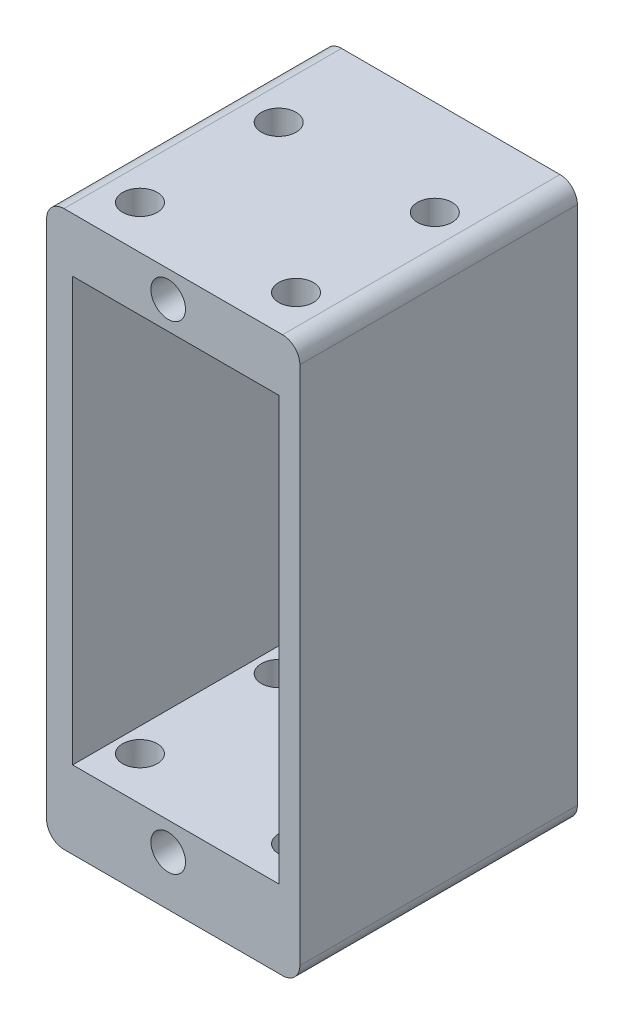
ISO-10303-21;
HEADER;
FILE_DESCRIPTION(('STEP AP214'),'2;1');
FILE_NAME('part.step','',(''),(''),'','','');
FILE_SCHEMA(('AUTOMOTIVE_DESIGN { 1 0 10303 214 1 1 1 1 }'));
ENDSEC;
DATA;
#1=APPLICATION_CONTEXT('core data for automotive mechanical design processes');
#2=APPLICATION_PROTOCOL_DEFINITION('international standard','automotive_design',2000,#1);
#3=PRODUCT_CONTEXT('',#1,'mechanical');
#4=PRODUCT('Part','Part','',(#3));
#5=PRODUCT_RELATED_PRODUCT_CATEGORY('part','',(#4));
#6=PRODUCT_DEFINITION_FORMATION('','',#4);
#7=PRODUCT_DEFINITION_CONTEXT('part definition',#1,'design');
#8=PRODUCT_DEFINITION('design','',#6,#7);
#9=PRODUCT_DEFINITION_SHAPE('','',#8);
#10=(LENGTH_UNIT() NAMED_UNIT(*) SI_UNIT(.MILLI.,.METRE.));
#11=(NAMED_UNIT(*) PLANE_ANGLE_UNIT() SI_UNIT($,.RADIAN.));
#12=(NAMED_UNIT(*) SI_UNIT($,.STERADIAN.) SOLID_ANGLE_UNIT());
#13=UNCERTAINTY_MEASURE_WITH_UNIT(LENGTH_MEASURE(1.E-05),#10,'distance_accuracy_value','');
#14=(GEOMETRIC_REPRESENTATION_CONTEXT(3) GLOBAL_UNCERTAINTY_ASSIGNED_CONTEXT((#13)) GLOBAL_UNIT_ASSIGNED_CONTEXT((#10,
#11,#12)) REPRESENTATION_CONTEXT('',''));
#15=CARTESIAN_POINT('',(0.,0.,0.));
#16=DIRECTION('',(0.,0.,1.));
#17=DIRECTION('',(1.,0.,0.));
#18=AXIS2_PLACEMENT_3D('',#15,#16,#17);
#19=CARTESIAN_POINT('',(-106.71772522006,235.327818509475,16.));
#20=DIRECTION('',(1.,0.,0.));
#21=DIRECTION('',(0.,0.,-1.));
#22=AXIS2_PLACEMENT_3D('',#19,#20,#21);
#23=PLANE('',#22);
#24=DIRECTION('',(0.,-1.,0.));
#25=VECTOR('',#24,1.);
#26=CARTESIAN_POINT('',(-106.71772522006,235.327818509475,0.));
#27=LINE('',#26,#25);
#28=CARTESIAN_POINT('',(-106.71772522006,234.327818509475,0.));
#29=VERTEX_POINT('',#28);
#30=CARTESIAN_POINT('',(-106.71772522006,204.327818509475,0.));
#31=VERTEX_POINT('',#30);
#32=EDGE_CURVE('E165',#29,#31,#27,.T.);
#33=ORIENTED_EDGE('',*,*,#32,.T.);
#34=DIRECTION('',(0.,0.,-1.));
#35=VECTOR('',#34,1.);
#36=CARTESIAN_POINT('',(-106.71772522006,204.327818509475,16.));
#37=LINE('',#36,#35);
#38=CARTESIAN_POINT('',(-106.71772522006,204.327818509475,16.));
#39=VERTEX_POINT('',#38);
#40=EDGE_CURVE('E221',#31,#39,#37,.F.);
#41=ORIENTED_EDGE('',*,*,#40,.T.);
#42=DIRECTION('',(0.,-1.,0.));
#43=VECTOR('',#42,1.);
#44=CARTESIAN_POINT('',(-106.71772522006,235.327818509475,16.));
#45=LINE('',#44,#43);
#46=CARTESIAN_POINT('',(-106.71772522006,234.327818509475,16.));
#47=VERTEX_POINT('',#46);
#48=EDGE_CURVE('E169',#47,#39,#45,.T.);
#49=ORIENTED_EDGE('',*,*,#48,.F.);
#50=DIRECTION('',(0.,0.,-1.));
#51=VECTOR('',#50,1.);
#52=CARTESIAN_POINT('',(-106.71772522006,234.327818509475,16.));
#53=LINE('',#52,#51);
#54=EDGE_CURVE('E218',#47,#29,#53,.T.);
#55=ORIENTED_EDGE('',*,*,#54,.T.);
#56=EDGE_LOOP('',(#33,#41,#49,#55));
#57=FACE_BOUND('',#56,.T.);
#58=ADVANCED_FACE('F37',(#57),#23,.F.);
#59=CARTESIAN_POINT('',(-106.71772522006,203.327818509475,16.));
#60=DIRECTION('',(0.,1.,0.));
#61=DIRECTION('',(0.,0.,1.));
#62=AXIS2_PLACEMENT_3D('',#59,#60,#61);
#63=PLANE('',#62);
#64=CARTESIAN_POINT('',(-103.837557168766,203.327818509475,13.5));
#65=DIRECTION('',(0.,1.,0.));
#66=DIRECTION('',(0.,0.,1.));
#67=AXIS2_PLACEMENT_3D('',#64,#65,#66);
#68=CIRCLE('',#67,0.999999999999998);
#69=CARTESIAN_POINT('',(-103.837557168766,203.327818509475,14.5));
#70=VERTEX_POINT('',#69);
#71=EDGE_CURVE('E366',#70,#70,#68,.T.);
#72=ORIENTED_EDGE('',*,*,#71,.T.);
#73=EDGE_LOOP('',(#72));
#74=FACE_BOUND('',#73,.T.);
#75=CARTESIAN_POINT('',(-94.8375571687659,203.327818509475,13.5));
#76=DIRECTION('',(0.,1.,0.));
#77=DIRECTION('',(0.,0.,1.));
#78=AXIS2_PLACEMENT_3D('',#75,#76,#77);
#79=CIRCLE('',#78,0.999999999999998);
#80=CARTESIAN_POINT('',(-94.8375571687659,203.327818509475,14.5));
#81=VERTEX_POINT('',#80);
#82=EDGE_CURVE('E369',#81,#81,#79,.T.);
#83=ORIENTED_EDGE('',*,*,#82,.T.);
#84=EDGE_LOOP('',(#83));
#85=FACE_BOUND('',#84,.T.);
#86=CARTESIAN_POINT('',(-94.837557168766,203.327818509475,5.5));
#87=DIRECTION('',(0.,1.,0.));
#88=DIRECTION('',(0.,0.,1.));
#89=AXIS2_PLACEMENT_3D('',#86,#87,#88);
#90=CIRCLE('',#89,0.999999999999998);
#91=CARTESIAN_POINT('',(-94.837557168766,203.327818509475,6.5));
#92=VERTEX_POINT('',#91);
#93=EDGE_CURVE('E359',#92,#92,#90,.T.);
#94=ORIENTED_EDGE('',*,*,#93,.T.);
#95=EDGE_LOOP('',(#94));
#96=FACE_BOUND('',#95,.T.);
#97=CARTESIAN_POINT('',(-103.837557168766,203.327818509475,5.5));
#98=DIRECTION('',(0.,1.,0.));
#99=DIRECTION('',(0.,0.,1.));
#100=AXIS2_PLACEMENT_3D('',#97,#98,#99);
#101=CIRCLE('',#100,0.999999999999998);
#102=CARTESIAN_POINT('',(-103.837557168766,203.327818509475,6.5));
#103=VERTEX_POINT('',#102);
#104=EDGE_CURVE('E228',#103,#103,#101,.T.);
#105=ORIENTED_EDGE('',*,*,#104,.T.);
#106=EDGE_LOOP('',(#105));
#107=FACE_BOUND('',#106,.T.);
#108=DIRECTION('',(1.,0.,0.));
#109=VECTOR('',#108,1.);
#110=CARTESIAN_POINT('',(-106.71772522006,203.327818509475,0.));
#111=LINE('',#110,#109);
#112=CARTESIAN_POINT('',(-105.71772522006,203.327818509475,0.));
#113=VERTEX_POINT('',#112);
#114=CARTESIAN_POINT('',(-93.1177252200604,203.327818509475,0.));
#115=VERTEX_POINT('',#114);
#116=EDGE_CURVE('E185',#113,#115,#111,.T.);
#117=ORIENTED_EDGE('',*,*,#116,.T.);
#118=DIRECTION('',(0.,0.,-1.));
#119=VECTOR('',#118,1.);
#120=CARTESIAN_POINT('',(-93.1177252200604,203.327818509475,16.));
#121=LINE('',#120,#119);
#122=CARTESIAN_POINT('',(-93.1177252200604,203.327818509475,16.));
#123=VERTEX_POINT('',#122);
#124=EDGE_CURVE('E208',#115,#123,#121,.F.);
#125=ORIENTED_EDGE('',*,*,#124,.T.);
#126=DIRECTION('',(1.,0.,0.));
#127=VECTOR('',#126,1.);
#128=CARTESIAN_POINT('',(-106.71772522006,203.327818509475,16.));
#129=LINE('',#128,#127);
#130=CARTESIAN_POINT('',(-105.71772522006,203.327818509475,16.));
#131=VERTEX_POINT('',#130);
#132=EDGE_CURVE('E172',#131,#123,#129,.T.);
#133=ORIENTED_EDGE('',*,*,#132,.F.);
#134=DIRECTION('',(0.,0.,-1.));
#135=VECTOR('',#134,1.);
#136=CARTESIAN_POINT('',(-105.71772522006,203.327818509475,16.));
#137=LINE('',#136,#135);
#138=EDGE_CURVE('E205',#131,#113,#137,.T.);
#139=ORIENTED_EDGE('',*,*,#138,.T.);
#140=EDGE_LOOP('',(#117,#125,#133,#139));
#141=FACE_BOUND('',#140,.T.);
#142=ADVANCED_FACE('F302',(#74,#85,#96,#107,#141),#63,.F.);
#143=CARTESIAN_POINT('',(-92.1177252200604,235.327818509475,16.));
#144=DIRECTION('',(-1.,0.,0.));
#145=DIRECTION('',(0.,0.,1.));
#146=AXIS2_PLACEMENT_3D('',#143,#144,#145);
#147=PLANE('',#146);
#148=DIRECTION('',(0.,1.,0.));
#149=VECTOR('',#148,1.);
#150=CARTESIAN_POINT('',(-92.1177252200604,235.327818509475,16.));
#151=LINE('',#150,#149);
#152=CARTESIAN_POINT('',(-92.1177252200604,204.327818509475,16.));
#153=VERTEX_POINT('',#152);
#154=CARTESIAN_POINT('',(-92.1177252200604,234.327818509475,16.));
#155=VERTEX_POINT('',#154);
#156=EDGE_CURVE('E176',#153,#155,#151,.T.);
#157=ORIENTED_EDGE('',*,*,#156,.F.);
#158=DIRECTION('',(0.,0.,-1.));
#159=VECTOR('',#158,1.);
#160=CARTESIAN_POINT('',(-92.1177252200604,204.327818509475,16.));
#161=LINE('',#160,#159);
#162=CARTESIAN_POINT('',(-92.1177252200604,204.327818509475,0.));
#163=VERTEX_POINT('',#162);
#164=EDGE_CURVE('E194',#153,#163,#161,.T.);
#165=ORIENTED_EDGE('',*,*,#164,.T.);
#166=DIRECTION('',(0.,1.,0.));
#167=VECTOR('',#166,1.);
#168=CARTESIAN_POINT('',(-92.1177252200604,235.327818509475,0.));
#169=LINE('',#168,#167);
#170=CARTESIAN_POINT('',(-92.1177252200604,234.327818509475,0.));
#171=VERTEX_POINT('',#170);
#172=EDGE_CURVE('E188',#163,#171,#169,.T.);
#173=ORIENTED_EDGE('',*,*,#172,.T.);
#174=DIRECTION('',(0.,0.,-1.));
#175=VECTOR('',#174,1.);
#176=CARTESIAN_POINT('',(-92.1177252200604,234.327818509475,16.));
#177=LINE('',#176,#175);
#178=EDGE_CURVE('E182',#171,#155,#177,.F.);
#179=ORIENTED_EDGE('',*,*,#178,.T.);
#180=EDGE_LOOP('',(#157,#165,#173,#179));
#181=FACE_BOUND('',#180,.T.);
#182=ADVANCED_FACE('F282',(#181),#147,.F.);
#183=CARTESIAN_POINT('',(-106.71772522006,235.327818509475,16.));
#184=DIRECTION('',(0.,-1.,0.));
#185=DIRECTION('',(0.,0.,-1.));
#186=AXIS2_PLACEMENT_3D('',#183,#184,#185);
#187=PLANE('',#186);
#188=CARTESIAN_POINT('',(-103.837557168766,235.327818509475,13.5));
#189=DIRECTION('',(0.,1.,0.));
#190=DIRECTION('',(0.,0.,1.));
#191=AXIS2_PLACEMENT_3D('',#188,#189,#190);
#192=CIRCLE('',#191,0.999999999999998);
#193=CARTESIAN_POINT('',(-103.837557168766,235.327818509475,14.5));
#194=VERTEX_POINT('',#193);
#195=EDGE_CURVE('E346',#194,#194,#192,.T.);
#196=ORIENTED_EDGE('',*,*,#195,.F.);
#197=EDGE_LOOP('',(#196));
#198=FACE_BOUND('',#197,.T.);
#199=CARTESIAN_POINT('',(-94.8375571687659,235.327818509475,13.5));
#200=DIRECTION('',(0.,1.,0.));
#201=DIRECTION('',(0.,0.,1.));
#202=AXIS2_PLACEMENT_3D('',#199,#200,#201);
#203=CIRCLE('',#202,0.999999999999998);
#204=CARTESIAN_POINT('',(-94.8375571687659,235.327818509475,14.5));
#205=VERTEX_POINT('',#204);
#206=EDGE_CURVE('E350',#205,#205,#203,.T.);
#207=ORIENTED_EDGE('',*,*,#206,.F.);
#208=EDGE_LOOP('',(#207));
#209=FACE_BOUND('',#208,.T.);
#210=CARTESIAN_POINT('',(-94.837557168766,235.327818509475,5.5));
#211=DIRECTION('',(0.,1.,0.));
#212=DIRECTION('',(0.,0.,1.));
#213=AXIS2_PLACEMENT_3D('',#210,#211,#212);
#214=CIRCLE('',#213,0.999999999999998);
#215=CARTESIAN_POINT('',(-94.837557168766,235.327818509475,6.5));
#216=VERTEX_POINT('',#215);
#217=EDGE_CURVE('E354',#216,#216,#214,.T.);
#218=ORIENTED_EDGE('',*,*,#217,.F.);
#219=EDGE_LOOP('',(#218));
#220=FACE_BOUND('',#219,.T.);
#221=CARTESIAN_POINT('',(-103.837557168766,235.327818509475,5.5));
#222=DIRECTION('',(0.,1.,0.));
#223=DIRECTION('',(0.,0.,1.));
#224=AXIS2_PLACEMENT_3D('',#221,#222,#223);
#225=CIRCLE('',#224,0.999999999999998);
#226=CARTESIAN_POINT('',(-103.837557168766,235.327818509475,6.5));
#227=VERTEX_POINT('',#226);
#228=EDGE_CURVE('E357',#227,#227,#225,.T.);
#229=ORIENTED_EDGE('',*,*,#228,.F.);
#230=EDGE_LOOP('',(#229));
#231=FACE_BOUND('',#230,.T.);
#232=DIRECTION('',(-1.,0.,0.));
#233=VECTOR('',#232,1.);
#234=CARTESIAN_POINT('',(-106.71772522006,235.327818509475,16.));
#235=LINE('',#234,#233);
#236=CARTESIAN_POINT('',(-93.1177252200604,235.327818509475,16.));
#237=VERTEX_POINT('',#236);
#238=CARTESIAN_POINT('',(-105.71772522006,235.327818509475,16.));
#239=VERTEX_POINT('',#238);
#240=EDGE_CURVE('E179',#237,#239,#235,.T.);
#241=ORIENTED_EDGE('',*,*,#240,.F.);
#242=DIRECTION('',(0.,0.,-1.));
#243=VECTOR('',#242,1.);
#244=CARTESIAN_POINT('',(-93.1177252200604,235.327818509475,16.));
#245=LINE('',#244,#243);
#246=CARTESIAN_POINT('',(-93.1177252200604,235.327818509475,0.));
#247=VERTEX_POINT('',#246);
#248=EDGE_CURVE('E11',#237,#247,#245,.T.);
#249=ORIENTED_EDGE('',*,*,#248,.T.);
#250=DIRECTION('',(-1.,0.,0.));
#251=VECTOR('',#250,1.);
#252=CARTESIAN_POINT('',(-106.71772522006,235.327818509475,0.));
#253=LINE('',#252,#251);
#254=CARTESIAN_POINT('',(-105.71772522006,235.327818509475,0.));
#255=VERTEX_POINT('',#254);
#256=EDGE_CURVE('E173',#247,#255,#253,.T.);
#257=ORIENTED_EDGE('',*,*,#256,.T.);
#258=DIRECTION('',(0.,0.,-1.));
#259=VECTOR('',#258,1.);
#260=CARTESIAN_POINT('',(-105.71772522006,235.327818509475,16.));
#261=LINE('',#260,#259);
#262=EDGE_CURVE('E46',#255,#239,#261,.F.);
#263=ORIENTED_EDGE('',*,*,#262,.T.);
#264=EDGE_LOOP('',(#241,#249,#257,#263));
#265=FACE_BOUND('',#264,.T.);
#266=ADVANCED_FACE('F265',(#198,#209,#220,#231,#265),#187,.F.);
#267=CARTESIAN_POINT('',(0.,0.,16.));
#268=DIRECTION('',(0.,0.,1.));
#269=DIRECTION('',(1.,0.,0.));
#270=AXIS2_PLACEMENT_3D('',#267,#268,#269);
#271=PLANE('',#270);
#272=CARTESIAN_POINT('',(-99.7091223045707,233.799996948242,16.));
#273=DIRECTION('',(0.,0.,1.));
#274=DIRECTION('',(1.,0.,0.));
#275=AXIS2_PLACEMENT_3D('',#272,#273,#274);
#276=CIRCLE('',#275,0.999999999999998);
#277=CARTESIAN_POINT('',(-98.7091223045707,233.799996948242,16.));
#278=VERTEX_POINT('',#277);
#279=EDGE_CURVE('E251',#278,#278,#276,.T.);
#280=ORIENTED_EDGE('',*,*,#279,.F.);
#281=EDGE_LOOP('',(#280));
#282=FACE_BOUND('',#281,.T.);
#283=CARTESIAN_POINT('',(-99.7091223045707,206.199996948242,16.));
#284=DIRECTION('',(0.,0.,1.));
#285=DIRECTION('',(1.,0.,0.));
#286=AXIS2_PLACEMENT_3D('',#283,#284,#285);
#287=CIRCLE('',#286,0.999999999999998);
#288=CARTESIAN_POINT('',(-98.7091223045707,206.199996948242,16.));
#289=VERTEX_POINT('',#288);
#290=EDGE_CURVE('E152',#289,#289,#287,.T.);
#291=ORIENTED_EDGE('',*,*,#290,.F.);
#292=EDGE_LOOP('',(#291));
#293=FACE_BOUND('',#292,.T.);
#294=DIRECTION('',(0.,-1.,0.));
#295=VECTOR('',#294,1.);
#296=CARTESIAN_POINT('',(-105.21772522006,232.199996948242,16.));
#297=LINE('',#296,#295);
#298=CARTESIAN_POINT('',(-105.21772522006,232.199996948242,16.));
#299=VERTEX_POINT('',#298);
#300=CARTESIAN_POINT('',(-105.21772522006,207.799996948242,16.));
#301=VERTEX_POINT('',#300);
#302=EDGE_CURVE('E54',#299,#301,#297,.T.);
#303=ORIENTED_EDGE('',*,*,#302,.F.);
#304=DIRECTION('',(-1.,0.,0.));
#305=VECTOR('',#304,1.);
#306=CARTESIAN_POINT('',(-105.21772522006,232.199996948242,16.));
#307=LINE('',#306,#305);
#308=CARTESIAN_POINT('',(-93.3177252200605,232.199996948242,16.));
#309=VERTEX_POINT('',#308);
#310=EDGE_CURVE('E146',#309,#299,#307,.T.);
#311=ORIENTED_EDGE('',*,*,#310,.F.);
#312=DIRECTION('',(0.,1.,0.));
#313=VECTOR('',#312,1.);
#314=CARTESIAN_POINT('',(-93.3177252200605,232.199996948242,16.));
#315=LINE('',#314,#313);
#316=CARTESIAN_POINT('',(-93.3177252200605,207.799996948242,16.));
#317=VERTEX_POINT('',#316);
#318=EDGE_CURVE('E149',#317,#309,#315,.T.);
#319=ORIENTED_EDGE('',*,*,#318,.F.);
#320=DIRECTION('',(1.,0.,0.));
#321=VECTOR('',#320,1.);
#322=CARTESIAN_POINT('',(-105.21772522006,207.799996948242,16.));
#323=LINE('',#322,#321);
#324=EDGE_CURVE('E158',#301,#317,#323,.T.);
#325=ORIENTED_EDGE('',*,*,#324,.F.);
#326=EDGE_LOOP('',(#303,#311,#319,#325));
#327=FACE_BOUND('',#326,.T.);
#328=ORIENTED_EDGE('',*,*,#132,.T.);
#329=CARTESIAN_POINT('',(-93.1177252200604,204.327818509475,16.));
#330=DIRECTION('',(0.,0.,1.));
#331=DIRECTION('',(1.,0.,0.));
#332=AXIS2_PLACEMENT_3D('',#329,#330,#331);
#333=CIRCLE('',#332,1.);
#334=EDGE_CURVE('E216',#123,#153,#333,.T.);
#335=ORIENTED_EDGE('',*,*,#334,.T.);
#336=ORIENTED_EDGE('',*,*,#156,.T.);
#337=CARTESIAN_POINT('',(-93.1177252200604,234.327818509475,16.));
#338=DIRECTION('',(0.,0.,1.));
#339=DIRECTION('',(1.,0.,0.));
#340=AXIS2_PLACEMENT_3D('',#337,#338,#339);
#341=CIRCLE('',#340,1.);
#342=EDGE_CURVE('E212',#155,#237,#341,.T.);
#343=ORIENTED_EDGE('',*,*,#342,.T.);
#344=ORIENTED_EDGE('',*,*,#240,.T.);
#345=CARTESIAN_POINT('',(-105.71772522006,234.327818509475,16.));
#346=DIRECTION('',(0.,0.,1.));
#347=DIRECTION('',(1.,0.,0.));
#348=AXIS2_PLACEMENT_3D('',#345,#346,#347);
#349=CIRCLE('',#348,1.);
#350=EDGE_CURVE('E210',#239,#47,#349,.T.);
#351=ORIENTED_EDGE('',*,*,#350,.T.);
#352=ORIENTED_EDGE('',*,*,#48,.T.);
#353=CARTESIAN_POINT('',(-105.71772522006,204.327818509475,16.));
#354=DIRECTION('',(0.,0.,1.));
#355=DIRECTION('',(1.,0.,0.));
#356=AXIS2_PLACEMENT_3D('',#353,#354,#355);
#357=CIRCLE('',#356,1.);
#358=EDGE_CURVE('E214',#39,#131,#357,.T.);
#359=ORIENTED_EDGE('',*,*,#358,.T.);
#360=EDGE_LOOP('',(#328,#335,#336,#343,#344,#351,#352,#359));
#361=FACE_BOUND('',#360,.T.);
#362=ADVANCED_FACE('F262',(#282,#293,#327,#361),#271,.T.);
#363=CARTESIAN_POINT('',(0.,0.,0.));
#364=DIRECTION('',(0.,0.,1.));
#365=DIRECTION('',(1.,0.,0.));
#366=AXIS2_PLACEMENT_3D('',#363,#364,#365);
#367=PLANE('',#366);
#368=CARTESIAN_POINT('',(-99.7091223045707,233.799996948242,0.));
#369=DIRECTION('',(0.,0.,1.));
#370=DIRECTION('',(1.,0.,0.));
#371=AXIS2_PLACEMENT_3D('',#368,#369,#370);
#372=CIRCLE('',#371,0.999999999999998);
#373=CARTESIAN_POINT('',(-98.7091223045707,233.799996948242,0.));
#374=VERTEX_POINT('',#373);
#375=EDGE_CURVE('E159',#374,#374,#372,.T.);
#376=ORIENTED_EDGE('',*,*,#375,.T.);
#377=EDGE_LOOP('',(#376));
#378=FACE_BOUND('',#377,.T.);
#379=CARTESIAN_POINT('',(-99.7091223045707,206.199996948242,0.));
#380=DIRECTION('',(0.,0.,1.));
#381=DIRECTION('',(1.,0.,0.));
#382=AXIS2_PLACEMENT_3D('',#379,#380,#381);
#383=CIRCLE('',#382,0.999999999999998);
#384=CARTESIAN_POINT('',(-98.7091223045707,206.199996948242,0.));
#385=VERTEX_POINT('',#384);
#386=EDGE_CURVE('E253',#385,#385,#383,.T.);
#387=ORIENTED_EDGE('',*,*,#386,.T.);
#388=EDGE_LOOP('',(#387));
#389=FACE_BOUND('',#388,.T.);
#390=DIRECTION('',(-1.,0.,0.));
#391=VECTOR('',#390,1.);
#392=CARTESIAN_POINT('',(-105.21772522006,232.199996948242,0.));
#393=LINE('',#392,#391);
#394=CARTESIAN_POINT('',(-93.3177252200605,232.199996948242,0.));
#395=VERTEX_POINT('',#394);
#396=CARTESIAN_POINT('',(-105.21772522006,232.199996948242,0.));
#397=VERTEX_POINT('',#396);
#398=EDGE_CURVE('E136',#395,#397,#393,.T.);
#399=ORIENTED_EDGE('',*,*,#398,.T.);
#400=DIRECTION('',(0.,-1.,0.));
#401=VECTOR('',#400,1.);
#402=CARTESIAN_POINT('',(-105.21772522006,232.199996948242,0.));
#403=LINE('',#402,#401);
#404=CARTESIAN_POINT('',(-105.21772522006,207.799996948242,0.));
#405=VERTEX_POINT('',#404);
#406=EDGE_CURVE('E130',#397,#405,#403,.T.);
#407=ORIENTED_EDGE('',*,*,#406,.T.);
#408=DIRECTION('',(1.,0.,0.));
#409=VECTOR('',#408,1.);
#410=CARTESIAN_POINT('',(-105.21772522006,207.799996948242,0.));
#411=LINE('',#410,#409);
#412=CARTESIAN_POINT('',(-93.3177252200605,207.799996948242,0.));
#413=VERTEX_POINT('',#412);
#414=EDGE_CURVE('E139',#405,#413,#411,.T.);
#415=ORIENTED_EDGE('',*,*,#414,.T.);
#416=DIRECTION('',(0.,1.,0.));
#417=VECTOR('',#416,1.);
#418=CARTESIAN_POINT('',(-93.3177252200605,232.199996948242,0.));
#419=LINE('',#418,#417);
#420=EDGE_CURVE('E62',#413,#395,#419,.T.);
#421=ORIENTED_EDGE('',*,*,#420,.T.);
#422=EDGE_LOOP('',(#399,#407,#415,#421));
#423=FACE_BOUND('',#422,.T.);
#424=ORIENTED_EDGE('',*,*,#172,.F.);
#425=CARTESIAN_POINT('',(-93.1177252200604,204.327818509475,0.));
#426=DIRECTION('',(0.,0.,1.));
#427=DIRECTION('',(1.,0.,0.));
#428=AXIS2_PLACEMENT_3D('',#425,#426,#427);
#429=CIRCLE('',#428,1.);
#430=EDGE_CURVE('E203',#163,#115,#429,.F.);
#431=ORIENTED_EDGE('',*,*,#430,.T.);
#432=ORIENTED_EDGE('',*,*,#116,.F.);
#433=CARTESIAN_POINT('',(-105.71772522006,204.327818509475,0.));
#434=DIRECTION('',(0.,0.,1.));
#435=DIRECTION('',(1.,0.,0.));
#436=AXIS2_PLACEMENT_3D('',#433,#434,#435);
#437=CIRCLE('',#436,1.);
#438=EDGE_CURVE('E201',#113,#31,#437,.F.);
#439=ORIENTED_EDGE('',*,*,#438,.T.);
#440=ORIENTED_EDGE('',*,*,#32,.F.);
#441=CARTESIAN_POINT('',(-105.71772522006,234.327818509475,0.));
#442=DIRECTION('',(0.,0.,1.));
#443=DIRECTION('',(1.,0.,0.));
#444=AXIS2_PLACEMENT_3D('',#441,#442,#443);
#445=CIRCLE('',#444,1.);
#446=EDGE_CURVE('E197',#29,#255,#445,.F.);
#447=ORIENTED_EDGE('',*,*,#446,.T.);
#448=ORIENTED_EDGE('',*,*,#256,.F.);
#449=CARTESIAN_POINT('',(-93.1177252200604,234.327818509475,0.));
#450=DIRECTION('',(0.,0.,1.));
#451=DIRECTION('',(1.,0.,0.));
#452=AXIS2_PLACEMENT_3D('',#449,#450,#451);
#453=CIRCLE('',#452,1.);
#454=EDGE_CURVE('E199',#247,#171,#453,.F.);
#455=ORIENTED_EDGE('',*,*,#454,.T.);
#456=EDGE_LOOP('',(#424,#431,#432,#439,#440,#447,#448,#455));
#457=FACE_BOUND('',#456,.T.);
#458=ADVANCED_FACE('F143',(#378,#389,#423,#457),#367,.F.);
#459=CARTESIAN_POINT('',(-93.1177252200604,204.327818509475,16.));
#460=DIRECTION('',(0.,0.,-1.));
#461=DIRECTION('',(-1.,0.,0.));
#462=AXIS2_PLACEMENT_3D('',#459,#460,#461);
#463=CYLINDRICAL_SURFACE('',#462,1.);
#464=ORIENTED_EDGE('',*,*,#334,.F.);
#465=ORIENTED_EDGE('',*,*,#124,.F.);
#466=ORIENTED_EDGE('',*,*,#430,.F.);
#467=ORIENTED_EDGE('',*,*,#164,.F.);
#468=EDGE_LOOP('',(#464,#465,#466,#467));
#469=FACE_BOUND('',#468,.T.);
#470=ADVANCED_FACE('F279',(#469),#463,.T.);
#471=CARTESIAN_POINT('',(-105.71772522006,204.327818509475,16.));
#472=DIRECTION('',(0.,0.,-1.));
#473=DIRECTION('',(-1.,0.,0.));
#474=AXIS2_PLACEMENT_3D('',#471,#472,#473);
#475=CYLINDRICAL_SURFACE('',#474,1.);
#476=ORIENTED_EDGE('',*,*,#358,.F.);
#477=ORIENTED_EDGE('',*,*,#40,.F.);
#478=ORIENTED_EDGE('',*,*,#438,.F.);
#479=ORIENTED_EDGE('',*,*,#138,.F.);
#480=EDGE_LOOP('',(#476,#477,#478,#479));
#481=FACE_BOUND('',#480,.T.);
#482=ADVANCED_FACE('F301',(#481),#475,.T.);
#483=CARTESIAN_POINT('',(-93.1177252200604,234.327818509475,16.));
#484=DIRECTION('',(0.,0.,-1.));
#485=DIRECTION('',(-1.,0.,0.));
#486=AXIS2_PLACEMENT_3D('',#483,#484,#485);
#487=CYLINDRICAL_SURFACE('',#486,1.);
#488=ORIENTED_EDGE('',*,*,#342,.F.);
#489=ORIENTED_EDGE('',*,*,#178,.F.);
#490=ORIENTED_EDGE('',*,*,#454,.F.);
#491=ORIENTED_EDGE('',*,*,#248,.F.);
#492=EDGE_LOOP('',(#488,#489,#490,#491));
#493=FACE_BOUND('',#492,.T.);
#494=ADVANCED_FACE('F289',(#493),#487,.T.);
#495=CARTESIAN_POINT('',(-105.71772522006,234.327818509475,16.));
#496=DIRECTION('',(0.,0.,-1.));
#497=DIRECTION('',(-1.,0.,0.));
#498=AXIS2_PLACEMENT_3D('',#495,#496,#497);
#499=CYLINDRICAL_SURFACE('',#498,1.);
#500=ORIENTED_EDGE('',*,*,#350,.F.);
#501=ORIENTED_EDGE('',*,*,#262,.F.);
#502=ORIENTED_EDGE('',*,*,#446,.F.);
#503=ORIENTED_EDGE('',*,*,#54,.F.);
#504=EDGE_LOOP('',(#500,#501,#502,#503));
#505=FACE_BOUND('',#504,.T.);
#506=ADVANCED_FACE('F39',(#505),#499,.T.);
#507=CARTESIAN_POINT('',(-105.21772522006,232.199996948242,0.));
#508=DIRECTION('',(-1.,0.,0.));
#509=DIRECTION('',(0.,0.,1.));
#510=AXIS2_PLACEMENT_3D('',#507,#508,#509);
#511=PLANE('',#510);
#512=ORIENTED_EDGE('',*,*,#302,.T.);
#513=DIRECTION('',(0.,0.,1.));
#514=VECTOR('',#513,1.);
#515=CARTESIAN_POINT('',(-105.21772522006,207.799996948242,0.));
#516=LINE('',#515,#514);
#517=EDGE_CURVE('E126',#405,#301,#516,.T.);
#518=ORIENTED_EDGE('',*,*,#517,.F.);
#519=ORIENTED_EDGE('',*,*,#406,.F.);
#520=DIRECTION('',(0.,0.,1.));
#521=VECTOR('',#520,1.);
#522=CARTESIAN_POINT('',(-105.21772522006,232.199996948242,0.));
#523=LINE('',#522,#521);
#524=EDGE_CURVE('E163',#397,#299,#523,.T.);
#525=ORIENTED_EDGE('',*,*,#524,.T.);
#526=EDGE_LOOP('',(#512,#518,#519,#525));
#527=FACE_BOUND('',#526,.T.);
#528=ADVANCED_FACE('F128',(#527),#511,.F.);
#529=CARTESIAN_POINT('',(-105.21772522006,232.199996948242,0.));
#530=DIRECTION('',(0.,1.,0.));
#531=DIRECTION('',(0.,0.,1.));
#532=AXIS2_PLACEMENT_3D('',#529,#530,#531);
#533=PLANE('',#532);
#534=CARTESIAN_POINT('',(-103.837557168766,232.199996948242,13.5));
#535=DIRECTION('',(0.,1.,0.));
#536=DIRECTION('',(0.,0.,1.));
#537=AXIS2_PLACEMENT_3D('',#534,#535,#536);
#538=CIRCLE('',#537,0.999999999999998);
#539=CARTESIAN_POINT('',(-103.837557168766,232.199996948242,14.5));
#540=VERTEX_POINT('',#539);
#541=EDGE_CURVE('E246',#540,#540,#538,.T.);
#542=ORIENTED_EDGE('',*,*,#541,.T.);
#543=EDGE_LOOP('',(#542));
#544=FACE_BOUND('',#543,.T.);
#545=CARTESIAN_POINT('',(-94.8375571687659,232.199996948242,13.5));
#546=DIRECTION('',(0.,1.,0.));
#547=DIRECTION('',(0.,0.,1.));
#548=AXIS2_PLACEMENT_3D('',#545,#546,#547);
#549=CIRCLE('',#548,0.999999999999998);
#550=CARTESIAN_POINT('',(-94.8375571687659,232.199996948242,14.5));
#551=VERTEX_POINT('',#550);
#552=EDGE_CURVE('E234',#551,#551,#549,.T.);
#553=ORIENTED_EDGE('',*,*,#552,.T.);
#554=EDGE_LOOP('',(#553));
#555=FACE_BOUND('',#554,.T.);
#556=CARTESIAN_POINT('',(-94.837557168766,232.199996948242,5.5));
#557=DIRECTION('',(0.,1.,0.));
#558=DIRECTION('',(0.,0.,1.));
#559=AXIS2_PLACEMENT_3D('',#556,#557,#558);
#560=CIRCLE('',#559,0.999999999999998);
#561=CARTESIAN_POINT('',(-94.837557168766,232.199996948242,6.5));
#562=VERTEX_POINT('',#561);
#563=EDGE_CURVE('E231',#562,#562,#560,.T.);
#564=ORIENTED_EDGE('',*,*,#563,.T.);
#565=EDGE_LOOP('',(#564));
#566=FACE_BOUND('',#565,.T.);
#567=CARTESIAN_POINT('',(-103.837557168766,232.199996948242,5.5));
#568=DIRECTION('',(0.,1.,0.));
#569=DIRECTION('',(0.,0.,1.));
#570=AXIS2_PLACEMENT_3D('',#567,#568,#569);
#571=CIRCLE('',#570,0.999999999999998);
#572=CARTESIAN_POINT('',(-103.837557168766,232.199996948242,6.5));
#573=VERTEX_POINT('',#572);
#574=EDGE_CURVE('E227',#573,#573,#571,.T.);
#575=ORIENTED_EDGE('',*,*,#574,.T.);
#576=EDGE_LOOP('',(#575));
#577=FACE_BOUND('',#576,.T.);
#578=ORIENTED_EDGE('',*,*,#310,.T.);
#579=ORIENTED_EDGE('',*,*,#524,.F.);
#580=ORIENTED_EDGE('',*,*,#398,.F.);
#581=DIRECTION('',(0.,0.,1.));
#582=VECTOR('',#581,1.);
#583=CARTESIAN_POINT('',(-93.3177252200605,232.199996948242,0.));
#584=LINE('',#583,#582);
#585=EDGE_CURVE('E166',#395,#309,#584,.T.);
#586=ORIENTED_EDGE('',*,*,#585,.T.);
#587=EDGE_LOOP('',(#578,#579,#580,#586));
#588=FACE_BOUND('',#587,.T.);
#589=ADVANCED_FACE('F326',(#544,#555,#566,#577,#588),#533,.F.);
#590=CARTESIAN_POINT('',(-93.3177252200605,232.199996948242,0.));
#591=DIRECTION('',(1.,0.,0.));
#592=DIRECTION('',(0.,1.,0.));
#593=AXIS2_PLACEMENT_3D('',#590,#591,#592);
#594=PLANE('',#593);
#595=ORIENTED_EDGE('',*,*,#318,.T.);
#596=ORIENTED_EDGE('',*,*,#585,.F.);
#597=ORIENTED_EDGE('',*,*,#420,.F.);
#598=DIRECTION('',(0.,0.,1.));
#599=VECTOR('',#598,1.);
#600=CARTESIAN_POINT('',(-93.3177252200605,207.799996948242,0.));
#601=LINE('',#600,#599);
#602=EDGE_CURVE('E135',#413,#317,#601,.T.);
#603=ORIENTED_EDGE('',*,*,#602,.T.);
#604=EDGE_LOOP('',(#595,#596,#597,#603));
#605=FACE_BOUND('',#604,.T.);
#606=ADVANCED_FACE('F331',(#605),#594,.F.);
#607=CARTESIAN_POINT('',(-105.21772522006,207.799996948242,0.));
#608=DIRECTION('',(0.,-1.,0.));
#609=DIRECTION('',(0.,0.,-1.));
#610=AXIS2_PLACEMENT_3D('',#607,#608,#609);
#611=PLANE('',#610);
#612=CARTESIAN_POINT('',(-103.837557168766,207.799996948242,13.5));
#613=DIRECTION('',(0.,-1.,0.));
#614=DIRECTION('',(0.,0.,-1.));
#615=AXIS2_PLACEMENT_3D('',#612,#613,#614);
#616=CIRCLE('',#615,0.999999999999998);
#617=CARTESIAN_POINT('',(-103.837557168766,207.799996948242,12.5));
#618=VERTEX_POINT('',#617);
#619=EDGE_CURVE('E41',#618,#618,#616,.T.);
#620=ORIENTED_EDGE('',*,*,#619,.T.);
#621=EDGE_LOOP('',(#620));
#622=FACE_BOUND('',#621,.T.);
#623=CARTESIAN_POINT('',(-94.8375571687659,207.799996948242,13.5));
#624=DIRECTION('',(0.,-1.,0.));
#625=DIRECTION('',(0.,0.,-1.));
#626=AXIS2_PLACEMENT_3D('',#623,#624,#625);
#627=CIRCLE('',#626,0.999999999999998);
#628=CARTESIAN_POINT('',(-94.8375571687659,207.799996948242,12.5));
#629=VERTEX_POINT('',#628);
#630=EDGE_CURVE('E232',#629,#629,#627,.T.);
#631=ORIENTED_EDGE('',*,*,#630,.T.);
#632=EDGE_LOOP('',(#631));
#633=FACE_BOUND('',#632,.T.);
#634=CARTESIAN_POINT('',(-94.837557168766,207.799996948242,5.5));
#635=DIRECTION('',(0.,-1.,0.));
#636=DIRECTION('',(0.,0.,-1.));
#637=AXIS2_PLACEMENT_3D('',#634,#635,#636);
#638=CIRCLE('',#637,0.999999999999998);
#639=CARTESIAN_POINT('',(-94.837557168766,207.799996948242,4.5));
#640=VERTEX_POINT('',#639);
#641=EDGE_CURVE('E229',#640,#640,#638,.T.);
#642=ORIENTED_EDGE('',*,*,#641,.T.);
#643=EDGE_LOOP('',(#642));
#644=FACE_BOUND('',#643,.T.);
#645=CARTESIAN_POINT('',(-103.837557168766,207.799996948242,5.5));
#646=DIRECTION('',(0.,-1.,0.));
#647=DIRECTION('',(0.,0.,-1.));
#648=AXIS2_PLACEMENT_3D('',#645,#646,#647);
#649=CIRCLE('',#648,0.999999999999998);
#650=CARTESIAN_POINT('',(-103.837557168766,207.799996948242,4.5));
#651=VERTEX_POINT('',#650);
#652=EDGE_CURVE('E224',#651,#651,#649,.T.);
#653=ORIENTED_EDGE('',*,*,#652,.T.);
#654=EDGE_LOOP('',(#653));
#655=FACE_BOUND('',#654,.T.);
#656=ORIENTED_EDGE('',*,*,#324,.T.);
#657=ORIENTED_EDGE('',*,*,#602,.F.);
#658=ORIENTED_EDGE('',*,*,#414,.F.);
#659=ORIENTED_EDGE('',*,*,#517,.T.);
#660=EDGE_LOOP('',(#656,#657,#658,#659));
#661=FACE_BOUND('',#660,.T.);
#662=ADVANCED_FACE('F140',(#622,#633,#644,#655,#661),#611,.F.);
#663=CARTESIAN_POINT('',(-99.7091223045707,206.199996948242,0.));
#664=DIRECTION('',(0.,0.,1.));
#665=DIRECTION('',(1.,0.,0.));
#666=AXIS2_PLACEMENT_3D('',#663,#664,#665);
#667=CYLINDRICAL_SURFACE('',#666,0.999999999999998);
#668=ORIENTED_EDGE('',*,*,#386,.F.);
#669=EDGE_LOOP('',(#668));
#670=FACE_BOUND('',#669,.T.);
#671=ORIENTED_EDGE('',*,*,#290,.T.);
#672=EDGE_LOOP('',(#671));
#673=FACE_BOUND('',#672,.T.);
#674=ADVANCED_FACE('F260',(#670,#673),#667,.F.);
#675=CARTESIAN_POINT('',(-99.7091223045707,233.799996948242,0.));
#676=DIRECTION('',(0.,0.,1.));
#677=DIRECTION('',(1.,0.,0.));
#678=AXIS2_PLACEMENT_3D('',#675,#676,#677);
#679=CYLINDRICAL_SURFACE('',#678,0.999999999999998);
#680=ORIENTED_EDGE('',*,*,#375,.F.);
#681=EDGE_LOOP('',(#680));
#682=FACE_BOUND('',#681,.T.);
#683=ORIENTED_EDGE('',*,*,#279,.T.);
#684=EDGE_LOOP('',(#683));
#685=FACE_BOUND('',#684,.T.);
#686=ADVANCED_FACE('F398',(#682,#685),#679,.F.);
#687=CARTESIAN_POINT('',(-103.837557168766,203.327818509475,5.5));
#688=DIRECTION('',(0.,1.,0.));
#689=DIRECTION('',(0.,0.,1.));
#690=AXIS2_PLACEMENT_3D('',#687,#688,#689);
#691=CYLINDRICAL_SURFACE('',#690,0.999999999999998);
#692=ORIENTED_EDGE('',*,*,#104,.F.);
#693=EDGE_LOOP('',(#692));
#694=FACE_BOUND('',#693,.T.);
#695=ORIENTED_EDGE('',*,*,#652,.F.);
#696=EDGE_LOOP('',(#695));
#697=FACE_BOUND('',#696,.T.);
#698=ADVANCED_FACE('F390',(#694,#697),#691,.F.);
#699=CARTESIAN_POINT('',(-94.837557168766,203.327818509475,5.5));
#700=DIRECTION('',(0.,1.,0.));
#701=DIRECTION('',(0.,0.,1.));
#702=AXIS2_PLACEMENT_3D('',#699,#700,#701);
#703=CYLINDRICAL_SURFACE('',#702,0.999999999999998);
#704=ORIENTED_EDGE('',*,*,#93,.F.);
#705=EDGE_LOOP('',(#704));
#706=FACE_BOUND('',#705,.T.);
#707=ORIENTED_EDGE('',*,*,#641,.F.);
#708=EDGE_LOOP('',(#707));
#709=FACE_BOUND('',#708,.T.);
#710=ADVANCED_FACE('F379',(#706,#709),#703,.F.);
#711=CARTESIAN_POINT('',(-94.8375571687659,203.327818509475,13.5));
#712=DIRECTION('',(0.,1.,0.));
#713=DIRECTION('',(0.,0.,1.));
#714=AXIS2_PLACEMENT_3D('',#711,#712,#713);
#715=CYLINDRICAL_SURFACE('',#714,0.999999999999998);
#716=ORIENTED_EDGE('',*,*,#82,.F.);
#717=EDGE_LOOP('',(#716));
#718=FACE_BOUND('',#717,.T.);
#719=ORIENTED_EDGE('',*,*,#630,.F.);
#720=EDGE_LOOP('',(#719));
#721=FACE_BOUND('',#720,.T.);
#722=ADVANCED_FACE('F387',(#718,#721),#715,.F.);
#723=CARTESIAN_POINT('',(-103.837557168766,203.327818509475,13.5));
#724=DIRECTION('',(0.,1.,0.));
#725=DIRECTION('',(0.,0.,1.));
#726=AXIS2_PLACEMENT_3D('',#723,#724,#725);
#727=CYLINDRICAL_SURFACE('',#726,0.999999999999998);
#728=ORIENTED_EDGE('',*,*,#71,.F.);
#729=EDGE_LOOP('',(#728));
#730=FACE_BOUND('',#729,.T.);
#731=ORIENTED_EDGE('',*,*,#619,.F.);
#732=EDGE_LOOP('',(#731));
#733=FACE_BOUND('',#732,.T.);
#734=ADVANCED_FACE('F388',(#730,#733),#727,.F.);
#735=ORIENTED_EDGE('',*,*,#228,.T.);
#736=EDGE_LOOP('',(#735));
#737=FACE_BOUND('',#736,.T.);
#738=ORIENTED_EDGE('',*,*,#574,.F.);
#739=EDGE_LOOP('',(#738));
#740=FACE_BOUND('',#739,.T.);
#741=ADVANCED_FACE('F377',(#737,#740),#691,.F.);
#742=ORIENTED_EDGE('',*,*,#217,.T.);
#743=EDGE_LOOP('',(#742));
#744=FACE_BOUND('',#743,.T.);
#745=ORIENTED_EDGE('',*,*,#563,.F.);
#746=EDGE_LOOP('',(#745));
#747=FACE_BOUND('',#746,.T.);
#748=ADVANCED_FACE('F373',(#744,#747),#703,.F.);
#749=ORIENTED_EDGE('',*,*,#206,.T.);
#750=EDGE_LOOP('',(#749));
#751=FACE_BOUND('',#750,.T.);
#752=ORIENTED_EDGE('',*,*,#552,.F.);
#753=EDGE_LOOP('',(#752));
#754=FACE_BOUND('',#753,.T.);
#755=ADVANCED_FACE('F376',(#751,#754),#715,.F.);
#756=ORIENTED_EDGE('',*,*,#195,.T.);
#757=EDGE_LOOP('',(#756));
#758=FACE_BOUND('',#757,.T.);
#759=ORIENTED_EDGE('',*,*,#541,.F.);
#760=EDGE_LOOP('',(#759));
#761=FACE_BOUND('',#760,.T.);
#762=ADVANCED_FACE('F384',(#758,#761),#727,.F.);
#763=CLOSED_SHELL('',(#58,#142,#182,#266,#362,#458,#470,#482,#494,#506,#528,#589,#606,#662,#674,
#686,#698,#710,#722,#734,#741,#748,#755,#762));
#764=MANIFOLD_SOLID_BREP('B2',#763);
#765=ADVANCED_BREP_SHAPE_REPRESENTATION('',(#18,#764),#14);
#766=SHAPE_DEFINITION_REPRESENTATION(#9,#765);
ENDSEC;
END-ISO-10303-21;
